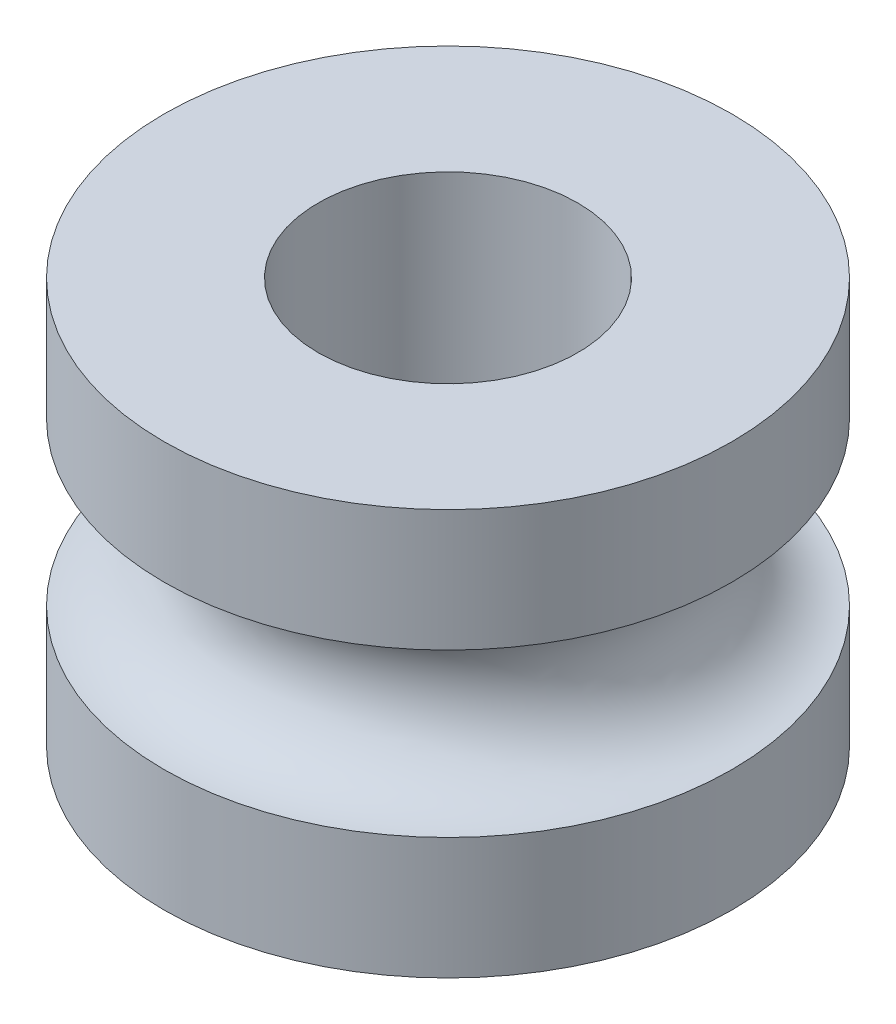
ISO-10303-21;
HEADER;
FILE_DESCRIPTION(('STEP AP214'),'2;1');
FILE_NAME('part.step','',(''),(''),'','','');
FILE_SCHEMA(('AUTOMOTIVE_DESIGN { 1 0 10303 214 1 1 1 1 }'));
ENDSEC;
DATA;
#1=APPLICATION_CONTEXT('core data for automotive mechanical design processes');
#2=APPLICATION_PROTOCOL_DEFINITION('international standard','automotive_design',2000,#1);
#3=PRODUCT_CONTEXT('',#1,'mechanical');
#4=PRODUCT('Part','Part','',(#3));
#5=PRODUCT_RELATED_PRODUCT_CATEGORY('part','',(#4));
#6=PRODUCT_DEFINITION_FORMATION('','',#4);
#7=PRODUCT_DEFINITION_CONTEXT('part definition',#1,'design');
#8=PRODUCT_DEFINITION('design','',#6,#7);
#9=PRODUCT_DEFINITION_SHAPE('','',#8);
#10=(LENGTH_UNIT() NAMED_UNIT(*) SI_UNIT(.MILLI.,.METRE.));
#11=(NAMED_UNIT(*) PLANE_ANGLE_UNIT() SI_UNIT($,.RADIAN.));
#12=(NAMED_UNIT(*) SI_UNIT($,.STERADIAN.) SOLID_ANGLE_UNIT());
#13=UNCERTAINTY_MEASURE_WITH_UNIT(LENGTH_MEASURE(1.E-05),#10,'distance_accuracy_value','');
#14=(GEOMETRIC_REPRESENTATION_CONTEXT(3) GLOBAL_UNCERTAINTY_ASSIGNED_CONTEXT((#13)) GLOBAL_UNIT_ASSIGNED_CONTEXT((#10,
#11,#12)) REPRESENTATION_CONTEXT('',''));
#15=CARTESIAN_POINT('',(0.,0.,0.));
#16=DIRECTION('',(0.,0.,1.));
#17=DIRECTION('',(1.,0.,0.));
#18=AXIS2_PLACEMENT_3D('',#15,#16,#17);
#19=CARTESIAN_POINT('',(0.,2.75,0.));
#20=DIRECTION('',(0.,1.,0.));
#21=DIRECTION('',(0.,0.,1.));
#22=AXIS2_PLACEMENT_3D('',#19,#20,#21);
#23=CYLINDRICAL_SURFACE('',#22,1.6);
#24=CARTESIAN_POINT('',(0.,2.5,0.));
#25=DIRECTION('',(0.,1.,0.));
#26=DIRECTION('',(0.,0.,1.));
#27=AXIS2_PLACEMENT_3D('',#24,#25,#26);
#28=CIRCLE('',#27,1.6);
#29=CARTESIAN_POINT('',(0.,2.5,1.6));
#30=VERTEX_POINT('',#29);
#31=EDGE_CURVE('E53',#30,#30,#28,.T.);
#32=ORIENTED_EDGE('',*,*,#31,.T.);
#33=EDGE_LOOP('',(#32));
#34=FACE_BOUND('',#33,.T.);
#35=CARTESIAN_POINT('',(0.,-2.5,0.));
#36=DIRECTION('',(0.,1.,0.));
#37=DIRECTION('',(0.,0.,1.));
#38=AXIS2_PLACEMENT_3D('',#35,#36,#37);
#39=CIRCLE('',#38,1.6);
#40=CARTESIAN_POINT('',(0.,-2.5,1.6));
#41=VERTEX_POINT('',#40);
#42=EDGE_CURVE('E10',#41,#41,#39,.T.);
#43=ORIENTED_EDGE('',*,*,#42,.F.);
#44=EDGE_LOOP('',(#43));
#45=FACE_BOUND('',#44,.T.);
#46=ADVANCED_FACE('F31',(#34,#45),#23,.F.);
#47=CARTESIAN_POINT('',(-3.5,-2.5,0.));
#48=DIRECTION('',(0.,-1.,0.));
#49=DIRECTION('',(0.,0.,-1.));
#50=AXIS2_PLACEMENT_3D('',#47,#48,#49);
#51=PLANE('',#50);
#52=ORIENTED_EDGE('',*,*,#42,.T.);
#53=EDGE_LOOP('',(#52));
#54=FACE_BOUND('',#53,.T.);
#55=CARTESIAN_POINT('',(0.,-2.5,0.));
#56=DIRECTION('',(0.,1.,0.));
#57=DIRECTION('',(0.,0.,1.));
#58=AXIS2_PLACEMENT_3D('',#55,#56,#57);
#59=CIRCLE('',#58,3.5);
#60=CARTESIAN_POINT('',(0.,-2.5,3.5));
#61=VERTEX_POINT('',#60);
#62=EDGE_CURVE('E37',#61,#61,#59,.T.);
#63=ORIENTED_EDGE('',*,*,#62,.F.);
#64=EDGE_LOOP('',(#63));
#65=FACE_BOUND('',#64,.T.);
#66=ADVANCED_FACE('F71',(#54,#65),#51,.T.);
#67=CARTESIAN_POINT('',(0.,2.75,0.));
#68=DIRECTION('',(0.,1.,0.));
#69=DIRECTION('',(0.,0.,1.));
#70=AXIS2_PLACEMENT_3D('',#67,#68,#69);
#71=CYLINDRICAL_SURFACE('',#70,3.5);
#72=ORIENTED_EDGE('',*,*,#62,.T.);
#73=EDGE_LOOP('',(#72));
#74=FACE_BOUND('',#73,.T.);
#75=CARTESIAN_POINT('',(0.,-1.,0.));
#76=DIRECTION('',(0.,1.,0.));
#77=DIRECTION('',(0.,0.,1.));
#78=AXIS2_PLACEMENT_3D('',#75,#76,#77);
#79=CIRCLE('',#78,3.5);
#80=CARTESIAN_POINT('',(0.,-1.,3.5));
#81=VERTEX_POINT('',#80);
#82=EDGE_CURVE('E41',#81,#81,#79,.T.);
#83=ORIENTED_EDGE('',*,*,#82,.F.);
#84=EDGE_LOOP('',(#83));
#85=FACE_BOUND('',#84,.T.);
#86=ADVANCED_FACE('F75',(#74,#85),#71,.T.);
#87=CARTESIAN_POINT('',(0.,0.,0.));
#88=DIRECTION('',(0.,1.,0.));
#89=DIRECTION('',(0.,0.,1.));
#90=AXIS2_PLACEMENT_3D('',#87,#88,#89);
#91=TOROIDAL_SURFACE('',#90,3.5,1.);
#92=ORIENTED_EDGE('',*,*,#82,.T.);
#93=EDGE_LOOP('',(#92));
#94=FACE_BOUND('',#93,.T.);
#95=CARTESIAN_POINT('',(0.,1.,0.));
#96=DIRECTION('',(0.,1.,0.));
#97=DIRECTION('',(0.,0.,1.));
#98=AXIS2_PLACEMENT_3D('',#95,#96,#97);
#99=CIRCLE('',#98,3.5);
#100=CARTESIAN_POINT('',(0.,1.,3.5));
#101=VERTEX_POINT('',#100);
#102=EDGE_CURVE('E45',#101,#101,#99,.T.);
#103=ORIENTED_EDGE('',*,*,#102,.F.);
#104=EDGE_LOOP('',(#103));
#105=FACE_BOUND('',#104,.T.);
#106=ADVANCED_FACE('F67',(#94,#105),#91,.F.);
#107=CARTESIAN_POINT('',(0.,2.75,0.));
#108=DIRECTION('',(0.,1.,0.));
#109=DIRECTION('',(0.,0.,1.));
#110=AXIS2_PLACEMENT_3D('',#107,#108,#109);
#111=CYLINDRICAL_SURFACE('',#110,3.5);
#112=ORIENTED_EDGE('',*,*,#102,.T.);
#113=EDGE_LOOP('',(#112));
#114=FACE_BOUND('',#113,.T.);
#115=CARTESIAN_POINT('',(0.,2.5,0.));
#116=DIRECTION('',(0.,1.,0.));
#117=DIRECTION('',(0.,0.,1.));
#118=AXIS2_PLACEMENT_3D('',#115,#116,#117);
#119=CIRCLE('',#118,3.5);
#120=CARTESIAN_POINT('',(0.,2.5,3.5));
#121=VERTEX_POINT('',#120);
#122=EDGE_CURVE('E50',#121,#121,#119,.T.);
#123=ORIENTED_EDGE('',*,*,#122,.F.);
#124=EDGE_LOOP('',(#123));
#125=FACE_BOUND('',#124,.T.);
#126=ADVANCED_FACE('F61',(#114,#125),#111,.T.);
#127=CARTESIAN_POINT('',(-1.6,2.5,0.));
#128=DIRECTION('',(0.,1.,0.));
#129=DIRECTION('',(0.,0.,1.));
#130=AXIS2_PLACEMENT_3D('',#127,#128,#129);
#131=PLANE('',#130);
#132=ORIENTED_EDGE('',*,*,#122,.T.);
#133=EDGE_LOOP('',(#132));
#134=FACE_BOUND('',#133,.T.);
#135=ORIENTED_EDGE('',*,*,#31,.F.);
#136=EDGE_LOOP('',(#135));
#137=FACE_BOUND('',#136,.T.);
#138=ADVANCED_FACE('F59',(#134,#137),#131,.T.);
#139=CLOSED_SHELL('',(#46,#66,#86,#106,#126,#138));
#140=MANIFOLD_SOLID_BREP('B2',#139);
#141=ADVANCED_BREP_SHAPE_REPRESENTATION('',(#18,#140),#14);
#142=SHAPE_DEFINITION_REPRESENTATION(#9,#141);
ENDSEC;
END-ISO-10303-21;
